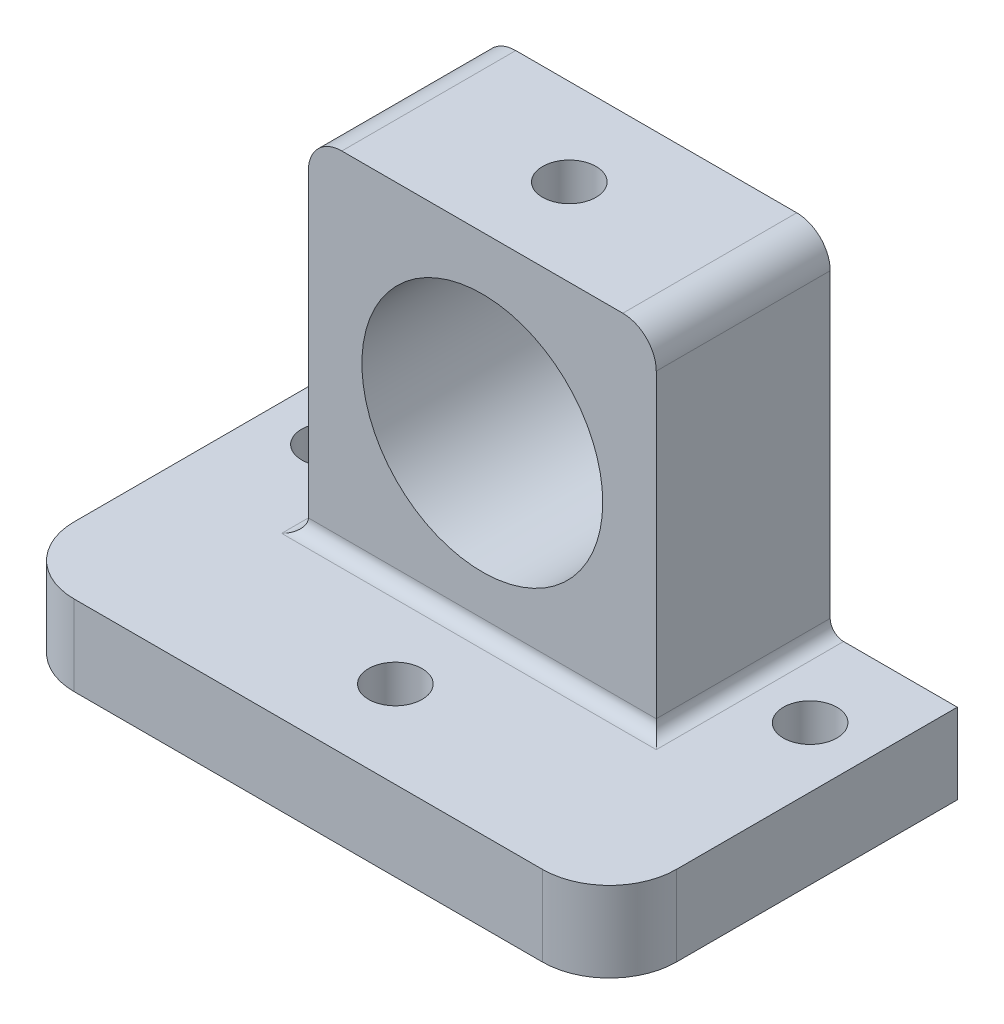
ISO-10303-21;
HEADER;
FILE_DESCRIPTION(('STEP AP214'),'2;1');
FILE_NAME('part.step','',(''),(''),'','','');
FILE_SCHEMA(('AUTOMOTIVE_DESIGN { 1 0 10303 214 1 1 1 1 }'));
ENDSEC;
DATA;
#1=APPLICATION_CONTEXT('core data for automotive mechanical design processes');
#2=APPLICATION_PROTOCOL_DEFINITION('international standard','automotive_design',2000,#1);
#3=PRODUCT_CONTEXT('',#1,'mechanical');
#4=PRODUCT('Part','Part','',(#3));
#5=PRODUCT_RELATED_PRODUCT_CATEGORY('part','',(#4));
#6=PRODUCT_DEFINITION_FORMATION('','',#4);
#7=PRODUCT_DEFINITION_CONTEXT('part definition',#1,'design');
#8=PRODUCT_DEFINITION('design','',#6,#7);
#9=PRODUCT_DEFINITION_SHAPE('','',#8);
#10=(LENGTH_UNIT() NAMED_UNIT(*) SI_UNIT(.MILLI.,.METRE.));
#11=(NAMED_UNIT(*) PLANE_ANGLE_UNIT() SI_UNIT($,.RADIAN.));
#12=(NAMED_UNIT(*) SI_UNIT($,.STERADIAN.) SOLID_ANGLE_UNIT());
#13=UNCERTAINTY_MEASURE_WITH_UNIT(LENGTH_MEASURE(1.E-05),#10,'distance_accuracy_value','');
#14=(GEOMETRIC_REPRESENTATION_CONTEXT(3) GLOBAL_UNCERTAINTY_ASSIGNED_CONTEXT((#13)) GLOBAL_UNIT_ASSIGNED_CONTEXT((#10,
#11,#12)) REPRESENTATION_CONTEXT('',''));
#15=CARTESIAN_POINT('',(0.,0.,0.));
#16=DIRECTION('',(0.,0.,1.));
#17=DIRECTION('',(1.,0.,0.));
#18=AXIS2_PLACEMENT_3D('',#15,#16,#17);
#19=CARTESIAN_POINT('',(-22.5,6.,0.));
#20=DIRECTION('',(1.,0.,0.));
#21=DIRECTION('',(0.,0.,-1.));
#22=AXIS2_PLACEMENT_3D('',#19,#20,#21);
#23=PLANE('',#22);
#24=DIRECTION('',(0.,0.,1.));
#25=VECTOR('',#24,1.);
#26=CARTESIAN_POINT('',(-22.5,0.,0.));
#27=LINE('',#26,#25);
#28=CARTESIAN_POINT('',(-22.5,0.,0.));
#29=VERTEX_POINT('',#28);
#30=CARTESIAN_POINT('',(-22.5,0.,21.));
#31=VERTEX_POINT('',#30);
#32=EDGE_CURVE('E166',#29,#31,#27,.T.);
#33=ORIENTED_EDGE('',*,*,#32,.T.);
#34=DIRECTION('',(0.,-1.,0.));
#35=VECTOR('',#34,1.);
#36=CARTESIAN_POINT('',(-22.5,6.,21.));
#37=LINE('',#36,#35);
#38=CARTESIAN_POINT('',(-22.5,6.,21.));
#39=VERTEX_POINT('',#38);
#40=EDGE_CURVE('E146',#39,#31,#37,.T.);
#41=ORIENTED_EDGE('',*,*,#40,.F.);
#42=DIRECTION('',(0.,0.,1.));
#43=VECTOR('',#42,1.);
#44=CARTESIAN_POINT('',(-22.5,6.,0.));
#45=LINE('',#44,#43);
#46=CARTESIAN_POINT('',(-22.5,6.,0.));
#47=VERTEX_POINT('',#46);
#48=EDGE_CURVE('E153',#47,#39,#45,.T.);
#49=ORIENTED_EDGE('',*,*,#48,.F.);
#50=DIRECTION('',(0.,-1.,0.));
#51=VECTOR('',#50,1.);
#52=CARTESIAN_POINT('',(-22.5,6.,0.));
#53=LINE('',#52,#51);
#54=EDGE_CURVE('E330',#47,#29,#53,.T.);
#55=ORIENTED_EDGE('',*,*,#54,.T.);
#56=EDGE_LOOP('',(#33,#41,#49,#55));
#57=FACE_BOUND('',#56,.T.);
#58=ADVANCED_FACE('F37',(#57),#23,.F.);
#59=CARTESIAN_POINT('',(-17.5,6.,21.));
#60=DIRECTION('',(0.,-1.,0.));
#61=DIRECTION('',(0.,0.,-1.));
#62=AXIS2_PLACEMENT_3D('',#59,#60,#61);
#63=CYLINDRICAL_SURFACE('',#62,5.);
#64=CARTESIAN_POINT('',(-17.5,0.,21.));
#65=DIRECTION('',(0.,1.,0.));
#66=DIRECTION('',(0.,0.,1.));
#67=AXIS2_PLACEMENT_3D('',#64,#65,#66);
#68=CIRCLE('',#67,5.);
#69=CARTESIAN_POINT('',(-17.5,0.,26.));
#70=VERTEX_POINT('',#69);
#71=EDGE_CURVE('E336',#31,#70,#68,.T.);
#72=ORIENTED_EDGE('',*,*,#71,.T.);
#73=DIRECTION('',(0.,-1.,0.));
#74=VECTOR('',#73,1.);
#75=CARTESIAN_POINT('',(-17.5,6.,26.));
#76=LINE('',#75,#74);
#77=CARTESIAN_POINT('',(-17.5,6.,26.));
#78=VERTEX_POINT('',#77);
#79=EDGE_CURVE('E149',#78,#70,#76,.T.);
#80=ORIENTED_EDGE('',*,*,#79,.F.);
#81=CARTESIAN_POINT('',(-17.5,6.,21.));
#82=DIRECTION('',(0.,1.,0.));
#83=DIRECTION('',(0.,0.,1.));
#84=AXIS2_PLACEMENT_3D('',#81,#82,#83);
#85=CIRCLE('',#84,5.);
#86=EDGE_CURVE('E142',#39,#78,#85,.T.);
#87=ORIENTED_EDGE('',*,*,#86,.F.);
#88=ORIENTED_EDGE('',*,*,#40,.T.);
#89=EDGE_LOOP('',(#72,#80,#87,#88));
#90=FACE_BOUND('',#89,.T.);
#91=ADVANCED_FACE('F144',(#90),#63,.T.);
#92=CARTESIAN_POINT('',(0.,6.,26.));
#93=DIRECTION('',(0.,0.,-1.));
#94=DIRECTION('',(-1.,0.,0.));
#95=AXIS2_PLACEMENT_3D('',#92,#93,#94);
#96=PLANE('',#95);
#97=DIRECTION('',(1.,0.,0.));
#98=VECTOR('',#97,1.);
#99=CARTESIAN_POINT('',(0.,0.,26.));
#100=LINE('',#99,#98);
#101=CARTESIAN_POINT('',(17.5,0.,26.));
#102=VERTEX_POINT('',#101);
#103=EDGE_CURVE('E338',#70,#102,#100,.T.);
#104=ORIENTED_EDGE('',*,*,#103,.T.);
#105=DIRECTION('',(0.,-1.,0.));
#106=VECTOR('',#105,1.);
#107=CARTESIAN_POINT('',(17.5,6.,26.));
#108=LINE('',#107,#106);
#109=CARTESIAN_POINT('',(17.5,6.,26.));
#110=VERTEX_POINT('',#109);
#111=EDGE_CURVE('E172',#110,#102,#108,.T.);
#112=ORIENTED_EDGE('',*,*,#111,.F.);
#113=DIRECTION('',(1.,0.,0.));
#114=VECTOR('',#113,1.);
#115=CARTESIAN_POINT('',(0.,6.,26.));
#116=LINE('',#115,#114);
#117=EDGE_CURVE('E152',#78,#110,#116,.T.);
#118=ORIENTED_EDGE('',*,*,#117,.F.);
#119=ORIENTED_EDGE('',*,*,#79,.T.);
#120=EDGE_LOOP('',(#104,#112,#118,#119));
#121=FACE_BOUND('',#120,.T.);
#122=ADVANCED_FACE('F279',(#121),#96,.F.);
#123=CARTESIAN_POINT('',(17.5,6.,21.));
#124=DIRECTION('',(0.,-1.,0.));
#125=DIRECTION('',(0.,0.,-1.));
#126=AXIS2_PLACEMENT_3D('',#123,#124,#125);
#127=CYLINDRICAL_SURFACE('',#126,5.);
#128=CARTESIAN_POINT('',(17.5,0.,21.));
#129=DIRECTION('',(0.,1.,0.));
#130=DIRECTION('',(0.,0.,1.));
#131=AXIS2_PLACEMENT_3D('',#128,#129,#130);
#132=CIRCLE('',#131,5.);
#133=CARTESIAN_POINT('',(22.5,0.,21.));
#134=VERTEX_POINT('',#133);
#135=EDGE_CURVE('E340',#102,#134,#132,.T.);
#136=ORIENTED_EDGE('',*,*,#135,.T.);
#137=DIRECTION('',(0.,-1.,0.));
#138=VECTOR('',#137,1.);
#139=CARTESIAN_POINT('',(22.5,6.,21.));
#140=LINE('',#139,#138);
#141=CARTESIAN_POINT('',(22.5,6.,21.));
#142=VERTEX_POINT('',#141);
#143=EDGE_CURVE('E357',#142,#134,#140,.T.);
#144=ORIENTED_EDGE('',*,*,#143,.F.);
#145=CARTESIAN_POINT('',(17.5,6.,21.));
#146=DIRECTION('',(0.,1.,0.));
#147=DIRECTION('',(0.,0.,1.));
#148=AXIS2_PLACEMENT_3D('',#145,#146,#147);
#149=CIRCLE('',#148,5.);
#150=EDGE_CURVE('E321',#110,#142,#149,.T.);
#151=ORIENTED_EDGE('',*,*,#150,.F.);
#152=ORIENTED_EDGE('',*,*,#111,.T.);
#153=EDGE_LOOP('',(#136,#144,#151,#152));
#154=FACE_BOUND('',#153,.T.);
#155=ADVANCED_FACE('F275',(#154),#127,.T.);
#156=CARTESIAN_POINT('',(22.5,6.,0.));
#157=DIRECTION('',(1.,0.,0.));
#158=DIRECTION('',(0.,0.,-1.));
#159=AXIS2_PLACEMENT_3D('',#156,#157,#158);
#160=PLANE('',#159);
#161=DIRECTION('',(0.,0.,1.));
#162=VECTOR('',#161,1.);
#163=CARTESIAN_POINT('',(22.5,0.,0.));
#164=LINE('',#163,#162);
#165=CARTESIAN_POINT('',(22.5,0.,0.));
#166=VERTEX_POINT('',#165);
#167=EDGE_CURVE('E343',#166,#134,#164,.T.);
#168=ORIENTED_EDGE('',*,*,#167,.F.);
#169=DIRECTION('',(0.,-1.,0.));
#170=VECTOR('',#169,1.);
#171=CARTESIAN_POINT('',(22.5,6.,0.));
#172=LINE('',#171,#170);
#173=CARTESIAN_POINT('',(22.5,6.,0.));
#174=VERTEX_POINT('',#173);
#175=EDGE_CURVE('E355',#174,#166,#172,.T.);
#176=ORIENTED_EDGE('',*,*,#175,.F.);
#177=DIRECTION('',(0.,0.,1.));
#178=VECTOR('',#177,1.);
#179=CARTESIAN_POINT('',(22.5,6.,0.));
#180=LINE('',#179,#178);
#181=EDGE_CURVE('E318',#174,#142,#180,.T.);
#182=ORIENTED_EDGE('',*,*,#181,.T.);
#183=ORIENTED_EDGE('',*,*,#143,.T.);
#184=EDGE_LOOP('',(#168,#176,#182,#183));
#185=FACE_BOUND('',#184,.T.);
#186=ADVANCED_FACE('F268',(#185),#160,.T.);
#187=CARTESIAN_POINT('',(-18.,6.,6.5));
#188=DIRECTION('',(0.,-1.,0.));
#189=DIRECTION('',(0.,0.,-1.));
#190=AXIS2_PLACEMENT_3D('',#187,#188,#189);
#191=CYLINDRICAL_SURFACE('',#190,2.);
#192=CARTESIAN_POINT('',(-18.,6.,6.5));
#193=DIRECTION('',(0.,1.,0.));
#194=DIRECTION('',(0.,0.,1.));
#195=AXIS2_PLACEMENT_3D('',#192,#193,#194);
#196=CIRCLE('',#195,2.);
#197=CARTESIAN_POINT('',(-18.,6.,8.5));
#198=VERTEX_POINT('',#197);
#199=EDGE_CURVE('E320',#198,#198,#196,.T.);
#200=ORIENTED_EDGE('',*,*,#199,.T.);
#201=EDGE_LOOP('',(#200));
#202=FACE_BOUND('',#201,.T.);
#203=CARTESIAN_POINT('',(-18.,0.,6.5));
#204=DIRECTION('',(0.,1.,0.));
#205=DIRECTION('',(0.,0.,1.));
#206=AXIS2_PLACEMENT_3D('',#203,#204,#205);
#207=CIRCLE('',#206,2.);
#208=CARTESIAN_POINT('',(-18.,0.,8.5));
#209=VERTEX_POINT('',#208);
#210=EDGE_CURVE('E348',#209,#209,#207,.T.);
#211=ORIENTED_EDGE('',*,*,#210,.F.);
#212=EDGE_LOOP('',(#211));
#213=FACE_BOUND('',#212,.T.);
#214=ADVANCED_FACE('F264',(#202,#213),#191,.F.);
#215=CARTESIAN_POINT('',(0.,6.,0.));
#216=DIRECTION('',(0.,0.,-1.));
#217=DIRECTION('',(-1.,0.,0.));
#218=AXIS2_PLACEMENT_3D('',#215,#216,#217);
#219=PLANE('',#218);
#220=CARTESIAN_POINT('',(0.,19.,0.));
#221=DIRECTION('',(0.,0.,1.));
#222=DIRECTION('',(1.,0.,0.));
#223=AXIS2_PLACEMENT_3D('',#220,#221,#222);
#224=CIRCLE('',#223,9.);
#225=CARTESIAN_POINT('',(9.,19.,0.));
#226=VERTEX_POINT('',#225);
#227=EDGE_CURVE('E384',#226,#226,#224,.T.);
#228=ORIENTED_EDGE('',*,*,#227,.T.);
#229=EDGE_LOOP('',(#228));
#230=FACE_BOUND('',#229,.T.);
#231=DIRECTION('',(0.,-1.,0.));
#232=VECTOR('',#231,1.);
#233=CARTESIAN_POINT('',(-13.,32.,0.));
#234=LINE('',#233,#232);
#235=CARTESIAN_POINT('',(-13.,29.5,0.));
#236=VERTEX_POINT('',#235);
#237=CARTESIAN_POINT('',(-13.,7.,0.));
#238=VERTEX_POINT('',#237);
#239=EDGE_CURVE('E373',#236,#238,#234,.T.);
#240=ORIENTED_EDGE('',*,*,#239,.F.);
#241=CARTESIAN_POINT('',(-10.5,29.5,0.));
#242=DIRECTION('',(0.,0.,-1.));
#243=DIRECTION('',(-1.,0.,0.));
#244=AXIS2_PLACEMENT_3D('',#241,#242,#243);
#245=CIRCLE('',#244,2.5);
#246=CARTESIAN_POINT('',(-10.5,32.,0.));
#247=VERTEX_POINT('',#246);
#248=EDGE_CURVE('E177',#236,#247,#245,.T.);
#249=ORIENTED_EDGE('',*,*,#248,.T.);
#250=DIRECTION('',(1.,0.,0.));
#251=VECTOR('',#250,1.);
#252=CARTESIAN_POINT('',(0.,32.,0.));
#253=LINE('',#252,#251);
#254=CARTESIAN_POINT('',(10.5,32.,0.));
#255=VERTEX_POINT('',#254);
#256=EDGE_CURVE('E378',#247,#255,#253,.T.);
#257=ORIENTED_EDGE('',*,*,#256,.T.);
#258=CARTESIAN_POINT('',(10.5,29.5,0.));
#259=DIRECTION('',(0.,0.,-1.));
#260=DIRECTION('',(-1.,0.,0.));
#261=AXIS2_PLACEMENT_3D('',#258,#259,#260);
#262=CIRCLE('',#261,2.5);
#263=CARTESIAN_POINT('',(13.,29.5,0.));
#264=VERTEX_POINT('',#263);
#265=EDGE_CURVE('E170',#255,#264,#262,.T.);
#266=ORIENTED_EDGE('',*,*,#265,.T.);
#267=DIRECTION('',(0.,-1.,0.));
#268=VECTOR('',#267,1.);
#269=CARTESIAN_POINT('',(13.,32.,0.));
#270=LINE('',#269,#268);
#271=CARTESIAN_POINT('',(13.,7.,0.));
#272=VERTEX_POINT('',#271);
#273=EDGE_CURVE('E315',#264,#272,#270,.T.);
#274=ORIENTED_EDGE('',*,*,#273,.T.);
#275=CARTESIAN_POINT('',(14.,7.,0.));
#276=DIRECTION('',(0.,0.,-1.));
#277=DIRECTION('',(-1.,0.,0.));
#278=AXIS2_PLACEMENT_3D('',#275,#276,#277);
#279=CIRCLE('',#278,1.);
#280=CARTESIAN_POINT('',(14.,6.,0.));
#281=VERTEX_POINT('',#280);
#282=EDGE_CURVE('E11',#272,#281,#279,.F.);
#283=ORIENTED_EDGE('',*,*,#282,.T.);
#284=DIRECTION('',(1.,0.,0.));
#285=VECTOR('',#284,1.);
#286=CARTESIAN_POINT('',(0.,6.,0.));
#287=LINE('',#286,#285);
#288=EDGE_CURVE('E313',#281,#174,#287,.T.);
#289=ORIENTED_EDGE('',*,*,#288,.T.);
#290=ORIENTED_EDGE('',*,*,#175,.T.);
#291=DIRECTION('',(1.,0.,0.));
#292=VECTOR('',#291,1.);
#293=CARTESIAN_POINT('',(0.,0.,0.));
#294=LINE('',#293,#292);
#295=EDGE_CURVE('E346',#29,#166,#294,.T.);
#296=ORIENTED_EDGE('',*,*,#295,.F.);
#297=ORIENTED_EDGE('',*,*,#54,.F.);
#298=CARTESIAN_POINT('',(-14.,6.,0.));
#299=VERTEX_POINT('',#298);
#300=EDGE_CURVE('E161',#47,#299,#287,.T.);
#301=ORIENTED_EDGE('',*,*,#300,.T.);
#302=CARTESIAN_POINT('',(-14.,7.,0.));
#303=DIRECTION('',(0.,0.,-1.));
#304=DIRECTION('',(-1.,0.,0.));
#305=AXIS2_PLACEMENT_3D('',#302,#303,#304);
#306=CIRCLE('',#305,1.);
#307=EDGE_CURVE('E46',#299,#238,#306,.F.);
#308=ORIENTED_EDGE('',*,*,#307,.T.);
#309=EDGE_LOOP('',(#240,#249,#257,#266,#274,#283,#289,#290,#296,#297,#301,#308));
#310=FACE_BOUND('',#309,.T.);
#311=ADVANCED_FACE('F267',(#230,#310),#219,.T.);
#312=CARTESIAN_POINT('',(0.,6.,19.5));
#313=DIRECTION('',(0.,-1.,0.));
#314=DIRECTION('',(0.,0.,-1.));
#315=AXIS2_PLACEMENT_3D('',#312,#313,#314);
#316=CYLINDRICAL_SURFACE('',#315,2.);
#317=CARTESIAN_POINT('',(0.,6.,19.5));
#318=DIRECTION('',(0.,1.,0.));
#319=DIRECTION('',(0.,0.,1.));
#320=AXIS2_PLACEMENT_3D('',#317,#318,#319);
#321=CIRCLE('',#320,2.);
#322=CARTESIAN_POINT('',(0.,6.,21.5));
#323=VERTEX_POINT('',#322);
#324=EDGE_CURVE('E163',#323,#323,#321,.T.);
#325=ORIENTED_EDGE('',*,*,#324,.T.);
#326=EDGE_LOOP('',(#325));
#327=FACE_BOUND('',#326,.T.);
#328=CARTESIAN_POINT('',(0.,0.,19.5));
#329=DIRECTION('',(0.,1.,0.));
#330=DIRECTION('',(0.,0.,1.));
#331=AXIS2_PLACEMENT_3D('',#328,#329,#330);
#332=CIRCLE('',#331,2.);
#333=CARTESIAN_POINT('',(0.,0.,21.5));
#334=VERTEX_POINT('',#333);
#335=EDGE_CURVE('E331',#334,#334,#332,.T.);
#336=ORIENTED_EDGE('',*,*,#335,.F.);
#337=EDGE_LOOP('',(#336));
#338=FACE_BOUND('',#337,.T.);
#339=ADVANCED_FACE('F262',(#327,#338),#316,.F.);
#340=CARTESIAN_POINT('',(18.,6.,6.5));
#341=DIRECTION('',(0.,-1.,0.));
#342=DIRECTION('',(0.,0.,-1.));
#343=AXIS2_PLACEMENT_3D('',#340,#341,#342);
#344=CYLINDRICAL_SURFACE('',#343,2.);
#345=CARTESIAN_POINT('',(18.,6.,6.5));
#346=DIRECTION('',(0.,1.,0.));
#347=DIRECTION('',(0.,0.,1.));
#348=AXIS2_PLACEMENT_3D('',#345,#346,#347);
#349=CIRCLE('',#348,2.);
#350=CARTESIAN_POINT('',(18.,6.,8.5));
#351=VERTEX_POINT('',#350);
#352=EDGE_CURVE('E327',#351,#351,#349,.F.);
#353=ORIENTED_EDGE('',*,*,#352,.F.);
#354=EDGE_LOOP('',(#353));
#355=FACE_BOUND('',#354,.T.);
#356=CARTESIAN_POINT('',(18.,0.,6.5));
#357=DIRECTION('',(0.,1.,0.));
#358=DIRECTION('',(0.,0.,1.));
#359=AXIS2_PLACEMENT_3D('',#356,#357,#358);
#360=CIRCLE('',#359,2.);
#361=CARTESIAN_POINT('',(18.,0.,8.5));
#362=VERTEX_POINT('',#361);
#363=EDGE_CURVE('E351',#362,#362,#360,.F.);
#364=ORIENTED_EDGE('',*,*,#363,.T.);
#365=EDGE_LOOP('',(#364));
#366=FACE_BOUND('',#365,.T.);
#367=ADVANCED_FACE('F255',(#355,#366),#344,.F.);
#368=CARTESIAN_POINT('',(0.,6.,0.));
#369=DIRECTION('',(0.,1.,0.));
#370=DIRECTION('',(0.,0.,1.));
#371=AXIS2_PLACEMENT_3D('',#368,#369,#370);
#372=PLANE('',#371);
#373=ORIENTED_EDGE('',*,*,#324,.F.);
#374=EDGE_LOOP('',(#373));
#375=FACE_BOUND('',#374,.T.);
#376=DIRECTION('',(1.,0.,0.));
#377=VECTOR('',#376,1.);
#378=CARTESIAN_POINT('',(0.,6.,13.9999999999942));
#379=LINE('',#378,#377);
#380=CARTESIAN_POINT('',(14.,6.,13.9999999999942));
#381=VERTEX_POINT('',#380);
#382=CARTESIAN_POINT('',(-14.,6.,13.9999999999942));
#383=VERTEX_POINT('',#382);
#384=EDGE_CURVE('E192',#381,#383,#379,.F.);
#385=ORIENTED_EDGE('',*,*,#384,.T.);
#386=DIRECTION('',(0.,0.,-1.));
#387=VECTOR('',#386,1.);
#388=CARTESIAN_POINT('',(-14.,6.,0.));
#389=LINE('',#388,#387);
#390=EDGE_CURVE('E194',#383,#299,#389,.T.);
#391=ORIENTED_EDGE('',*,*,#390,.T.);
#392=ORIENTED_EDGE('',*,*,#300,.F.);
#393=ORIENTED_EDGE('',*,*,#48,.T.);
#394=ORIENTED_EDGE('',*,*,#86,.T.);
#395=ORIENTED_EDGE('',*,*,#117,.T.);
#396=ORIENTED_EDGE('',*,*,#150,.T.);
#397=ORIENTED_EDGE('',*,*,#181,.F.);
#398=ORIENTED_EDGE('',*,*,#288,.F.);
#399=DIRECTION('',(0.,0.,-1.));
#400=VECTOR('',#399,1.);
#401=CARTESIAN_POINT('',(14.,6.,0.));
#402=LINE('',#401,#400);
#403=EDGE_CURVE('E190',#281,#381,#402,.F.);
#404=ORIENTED_EDGE('',*,*,#403,.T.);
#405=EDGE_LOOP('',(#385,#391,#392,#393,#394,#395,#396,#397,#398,#404));
#406=FACE_BOUND('',#405,.T.);
#407=ORIENTED_EDGE('',*,*,#199,.F.);
#408=EDGE_LOOP('',(#407));
#409=FACE_BOUND('',#408,.T.);
#410=ORIENTED_EDGE('',*,*,#352,.T.);
#411=EDGE_LOOP('',(#410));
#412=FACE_BOUND('',#411,.T.);
#413=ADVANCED_FACE('F157',(#375,#406,#409,#412),#372,.T.);
#414=CARTESIAN_POINT('',(0.,0.,0.));
#415=DIRECTION('',(0.,1.,0.));
#416=DIRECTION('',(0.,0.,1.));
#417=AXIS2_PLACEMENT_3D('',#414,#415,#416);
#418=PLANE('',#417);
#419=ORIENTED_EDGE('',*,*,#295,.T.);
#420=ORIENTED_EDGE('',*,*,#167,.T.);
#421=ORIENTED_EDGE('',*,*,#135,.F.);
#422=ORIENTED_EDGE('',*,*,#103,.F.);
#423=ORIENTED_EDGE('',*,*,#71,.F.);
#424=ORIENTED_EDGE('',*,*,#32,.F.);
#425=EDGE_LOOP('',(#419,#420,#421,#422,#423,#424));
#426=FACE_BOUND('',#425,.T.);
#427=ORIENTED_EDGE('',*,*,#335,.T.);
#428=EDGE_LOOP('',(#427));
#429=FACE_BOUND('',#428,.T.);
#430=ORIENTED_EDGE('',*,*,#210,.T.);
#431=EDGE_LOOP('',(#430));
#432=FACE_BOUND('',#431,.T.);
#433=ORIENTED_EDGE('',*,*,#363,.F.);
#434=EDGE_LOOP('',(#433));
#435=FACE_BOUND('',#434,.T.);
#436=ADVANCED_FACE('F251',(#426,#429,#432,#435),#418,.F.);
#437=CARTESIAN_POINT('',(0.,32.,12.9999999999942));
#438=DIRECTION('',(0.,0.,-1.));
#439=DIRECTION('',(-1.,0.,0.));
#440=AXIS2_PLACEMENT_3D('',#437,#438,#439);
#441=PLANE('',#440);
#442=CARTESIAN_POINT('',(0.,19.,12.9999999999942));
#443=DIRECTION('',(0.,0.,1.));
#444=DIRECTION('',(1.,0.,0.));
#445=AXIS2_PLACEMENT_3D('',#442,#443,#444);
#446=CIRCLE('',#445,9.);
#447=CARTESIAN_POINT('',(9.,19.,12.9999999999942));
#448=VERTEX_POINT('',#447);
#449=EDGE_CURVE('E217',#448,#448,#446,.T.);
#450=ORIENTED_EDGE('',*,*,#449,.F.);
#451=EDGE_LOOP('',(#450));
#452=FACE_BOUND('',#451,.T.);
#453=DIRECTION('',(0.,-1.,0.));
#454=VECTOR('',#453,1.);
#455=CARTESIAN_POINT('',(-13.,32.,12.9999999999942));
#456=LINE('',#455,#454);
#457=CARTESIAN_POINT('',(-13.,29.5,12.9999999999942));
#458=VERTEX_POINT('',#457);
#459=CARTESIAN_POINT('',(-13.,7.,12.9999999999942));
#460=VERTEX_POINT('',#459);
#461=EDGE_CURVE('E376',#458,#460,#456,.T.);
#462=ORIENTED_EDGE('',*,*,#461,.T.);
#463=DIRECTION('',(1.,0.,0.));
#464=VECTOR('',#463,1.);
#465=CARTESIAN_POINT('',(0.,7.,12.9999999999942));
#466=LINE('',#465,#464);
#467=CARTESIAN_POINT('',(13.,7.,12.9999999999942));
#468=VERTEX_POINT('',#467);
#469=EDGE_CURVE('E62',#460,#468,#466,.T.);
#470=ORIENTED_EDGE('',*,*,#469,.T.);
#471=DIRECTION('',(0.,-1.,0.));
#472=VECTOR('',#471,1.);
#473=CARTESIAN_POINT('',(13.,32.,12.9999999999942));
#474=LINE('',#473,#472);
#475=CARTESIAN_POINT('',(13.,29.5,12.9999999999942));
#476=VERTEX_POINT('',#475);
#477=EDGE_CURVE('E334',#476,#468,#474,.T.);
#478=ORIENTED_EDGE('',*,*,#477,.F.);
#479=CARTESIAN_POINT('',(10.5,29.5,12.9999999999942));
#480=DIRECTION('',(0.,0.,-1.));
#481=DIRECTION('',(-1.,0.,0.));
#482=AXIS2_PLACEMENT_3D('',#479,#480,#481);
#483=CIRCLE('',#482,2.5);
#484=CARTESIAN_POINT('',(10.5,32.,12.9999999999942));
#485=VERTEX_POINT('',#484);
#486=EDGE_CURVE('E184',#476,#485,#483,.F.);
#487=ORIENTED_EDGE('',*,*,#486,.T.);
#488=DIRECTION('',(1.,0.,0.));
#489=VECTOR('',#488,1.);
#490=CARTESIAN_POINT('',(0.,32.,12.9999999999942));
#491=LINE('',#490,#489);
#492=CARTESIAN_POINT('',(-10.5,32.,12.9999999999942));
#493=VERTEX_POINT('',#492);
#494=EDGE_CURVE('E381',#493,#485,#491,.T.);
#495=ORIENTED_EDGE('',*,*,#494,.F.);
#496=CARTESIAN_POINT('',(-10.5,29.5,12.9999999999942));
#497=DIRECTION('',(0.,0.,-1.));
#498=DIRECTION('',(-1.,0.,0.));
#499=AXIS2_PLACEMENT_3D('',#496,#497,#498);
#500=CIRCLE('',#499,2.5);
#501=EDGE_CURVE('E186',#493,#458,#500,.F.);
#502=ORIENTED_EDGE('',*,*,#501,.T.);
#503=EDGE_LOOP('',(#462,#470,#478,#487,#495,#502));
#504=FACE_BOUND('',#503,.T.);
#505=ADVANCED_FACE('F248',(#452,#504),#441,.F.);
#506=CARTESIAN_POINT('',(13.,32.,0.));
#507=DIRECTION('',(-1.,0.,0.));
#508=DIRECTION('',(0.,0.,1.));
#509=AXIS2_PLACEMENT_3D('',#506,#507,#508);
#510=PLANE('',#509);
#511=ORIENTED_EDGE('',*,*,#477,.T.);
#512=DIRECTION('',(0.,0.,-1.));
#513=VECTOR('',#512,1.);
#514=CARTESIAN_POINT('',(13.,7.,0.));
#515=LINE('',#514,#513);
#516=EDGE_CURVE('E54',#468,#272,#515,.T.);
#517=ORIENTED_EDGE('',*,*,#516,.T.);
#518=ORIENTED_EDGE('',*,*,#273,.F.);
#519=DIRECTION('',(0.,0.,-1.));
#520=VECTOR('',#519,1.);
#521=CARTESIAN_POINT('',(13.,29.5,12.9999999999942));
#522=LINE('',#521,#520);
#523=EDGE_CURVE('E188',#264,#476,#522,.F.);
#524=ORIENTED_EDGE('',*,*,#523,.T.);
#525=EDGE_LOOP('',(#511,#517,#518,#524));
#526=FACE_BOUND('',#525,.T.);
#527=ADVANCED_FACE('F244',(#526),#510,.F.);
#528=CARTESIAN_POINT('',(-13.,32.,0.));
#529=DIRECTION('',(-1.,0.,0.));
#530=DIRECTION('',(0.,0.,1.));
#531=AXIS2_PLACEMENT_3D('',#528,#529,#530);
#532=PLANE('',#531);
#533=ORIENTED_EDGE('',*,*,#239,.T.);
#534=DIRECTION('',(0.,0.,-1.));
#535=VECTOR('',#534,1.);
#536=CARTESIAN_POINT('',(-13.,7.,12.9999999999942));
#537=LINE('',#536,#535);
#538=EDGE_CURVE('E196',#238,#460,#537,.F.);
#539=ORIENTED_EDGE('',*,*,#538,.T.);
#540=ORIENTED_EDGE('',*,*,#461,.F.);
#541=DIRECTION('',(0.,0.,-1.));
#542=VECTOR('',#541,1.);
#543=CARTESIAN_POINT('',(-13.,29.5,0.));
#544=LINE('',#543,#542);
#545=EDGE_CURVE('E167',#458,#236,#544,.T.);
#546=ORIENTED_EDGE('',*,*,#545,.T.);
#547=EDGE_LOOP('',(#533,#539,#540,#546));
#548=FACE_BOUND('',#547,.T.);
#549=ADVANCED_FACE('F240',(#548),#532,.T.);
#550=CARTESIAN_POINT('',(0.,32.,0.));
#551=DIRECTION('',(0.,1.,0.));
#552=DIRECTION('',(0.,0.,1.));
#553=AXIS2_PLACEMENT_3D('',#550,#551,#552);
#554=PLANE('',#553);
#555=CARTESIAN_POINT('',(0.,32.,6.5));
#556=DIRECTION('',(0.,1.,0.));
#557=DIRECTION('',(0.,0.,1.));
#558=AXIS2_PLACEMENT_3D('',#555,#556,#557);
#559=CIRCLE('',#558,2.);
#560=CARTESIAN_POINT('',(0.,32.,8.5));
#561=VERTEX_POINT('',#560);
#562=EDGE_CURVE('E212',#561,#561,#559,.T.);
#563=ORIENTED_EDGE('',*,*,#562,.F.);
#564=EDGE_LOOP('',(#563));
#565=FACE_BOUND('',#564,.T.);
#566=ORIENTED_EDGE('',*,*,#256,.F.);
#567=DIRECTION('',(0.,0.,-1.));
#568=VECTOR('',#567,1.);
#569=CARTESIAN_POINT('',(-10.5,32.,0.));
#570=LINE('',#569,#568);
#571=EDGE_CURVE('E182',#247,#493,#570,.F.);
#572=ORIENTED_EDGE('',*,*,#571,.T.);
#573=ORIENTED_EDGE('',*,*,#494,.T.);
#574=DIRECTION('',(0.,0.,-1.));
#575=VECTOR('',#574,1.);
#576=CARTESIAN_POINT('',(10.5,32.,0.));
#577=LINE('',#576,#575);
#578=EDGE_CURVE('E179',#485,#255,#577,.T.);
#579=ORIENTED_EDGE('',*,*,#578,.T.);
#580=EDGE_LOOP('',(#566,#572,#573,#579));
#581=FACE_BOUND('',#580,.T.);
#582=ADVANCED_FACE('F236',(#565,#581),#554,.T.);
#583=CARTESIAN_POINT('',(-10.5,29.5,0.));
#584=DIRECTION('',(0.,0.,-1.));
#585=DIRECTION('',(-1.,0.,0.));
#586=AXIS2_PLACEMENT_3D('',#583,#584,#585);
#587=CYLINDRICAL_SURFACE('',#586,2.5);
#588=ORIENTED_EDGE('',*,*,#501,.F.);
#589=ORIENTED_EDGE('',*,*,#571,.F.);
#590=ORIENTED_EDGE('',*,*,#248,.F.);
#591=ORIENTED_EDGE('',*,*,#545,.F.);
#592=EDGE_LOOP('',(#588,#589,#590,#591));
#593=FACE_BOUND('',#592,.T.);
#594=ADVANCED_FACE('F239',(#593),#587,.T.);
#595=CARTESIAN_POINT('',(10.5,29.5,0.));
#596=DIRECTION('',(0.,0.,1.));
#597=DIRECTION('',(1.,0.,0.));
#598=AXIS2_PLACEMENT_3D('',#595,#596,#597);
#599=CYLINDRICAL_SURFACE('',#598,2.5);
#600=ORIENTED_EDGE('',*,*,#486,.F.);
#601=ORIENTED_EDGE('',*,*,#523,.F.);
#602=ORIENTED_EDGE('',*,*,#265,.F.);
#603=ORIENTED_EDGE('',*,*,#578,.F.);
#604=EDGE_LOOP('',(#600,#601,#602,#603));
#605=FACE_BOUND('',#604,.T.);
#606=ADVANCED_FACE('F234',(#605),#599,.T.);
#607=CARTESIAN_POINT('',(0.,19.,0.));
#608=DIRECTION('',(0.,0.,1.));
#609=DIRECTION('',(1.,0.,0.));
#610=AXIS2_PLACEMENT_3D('',#607,#608,#609);
#611=CYLINDRICAL_SURFACE('',#610,9.);
#612=CARTESIAN_POINT('',(0.,28.,8.5));
#613=CARTESIAN_POINT('',(-0.110880476775648,27.9999979621825,8.49999627632018));
#614=CARTESIAN_POINT('',(-0.221805565269619,27.9979301399569,8.49074801833651));
#615=CARTESIAN_POINT('',(-0.440501944103133,27.9898809775767,8.45403952764945));
#616=CARTESIAN_POINT('',(-0.548270975138987,27.9838969021735,8.42656656599072));
#617=CARTESIAN_POINT('',(-0.757463277761528,27.9686811316901,8.35431402950835));
#618=CARTESIAN_POINT('',(-0.858893152100284,27.9594528843908,8.30955282300213));
#619=CARTESIAN_POINT('',(-1.05280018031376,27.9387433544138,8.2040533875276));
#620=CARTESIAN_POINT('',(-1.14527750793334,27.9272621154736,8.14331546870939));
#621=CARTESIAN_POINT('',(-1.32018631401403,27.9030909417421,8.00652433489332));
#622=CARTESIAN_POINT('',(-1.40244861204353,27.8903856164143,7.93025749786486));
#623=CARTESIAN_POINT('',(-1.55312491045837,27.8653060107979,7.76503193990686));
#624=CARTESIAN_POINT('',(-1.62153764410855,27.8529317608805,7.67607205928954));
#625=CARTESIAN_POINT('',(-1.7433244341035,27.8297632826171,7.4867281559417));
#626=CARTESIAN_POINT('',(-1.79651742104403,27.8189887574298,7.38622504195847));
#627=CARTESIAN_POINT('',(-1.88519298954508,27.8004609635239,7.17742723830758));
#628=CARTESIAN_POINT('',(-1.92067776220096,27.7927073210477,7.06913351449575));
#629=CARTESIAN_POINT('',(-1.97236858006404,27.7812560945919,6.84966652267734));
#630=CARTESIAN_POINT('',(-1.98887467038069,27.7774954580778,6.73856728489457));
#631=CARTESIAN_POINT('',(-2.00307270997673,27.7742667373067,6.5151177822138));
#632=CARTESIAN_POINT('',(-2.00076704911663,27.7747981077894,6.40276767803785));
#633=CARTESIAN_POINT('',(-1.97764827517302,27.7800363214815,6.1822433728062));
#634=CARTESIAN_POINT('',(-1.95718464460217,27.7846643138484,6.07403037586065));
#635=CARTESIAN_POINT('',(-1.89888490681146,27.7974495419168,5.862612856675));
#636=CARTESIAN_POINT('',(-1.86104779681651,27.8056069813318,5.7594086239146));
#637=CARTESIAN_POINT('',(-1.76875672872875,27.824609099703,5.55996056161812));
#638=CARTESIAN_POINT('',(-1.71416919379353,27.8354752436249,5.46378067266393));
#639=CARTESIAN_POINT('',(-1.59002068139849,27.8586573791074,5.28181712948411));
#640=CARTESIAN_POINT('',(-1.52045760074274,27.870973574206,5.19603493817985));
#641=CARTESIAN_POINT('',(-1.36648683702983,27.8960057461267,5.03529069065153));
#642=CARTESIAN_POINT('',(-1.28178220526623,27.9087245068787,4.96061321489494));
#643=CARTESIAN_POINT('',(-1.10090661809162,27.9328783912232,4.82647627109289));
#644=CARTESIAN_POINT('',(-1.00473544183737,27.9443134900843,4.76701709621811));
#645=CARTESIAN_POINT('',(-0.803303190734733,27.9646506423361,4.66493072422319));
#646=CARTESIAN_POINT('',(-0.698022122319853,27.9735469300766,4.62234175569174));
#647=CARTESIAN_POINT('',(-0.481555930981455,27.9877613636625,4.55553898694213));
#648=CARTESIAN_POINT('',(-0.370371697593364,27.9930800469679,4.53132242658588));
#649=CARTESIAN_POINT('',(-0.147695483280843,27.9994631776167,4.50236798674483));
#650=CARTESIAN_POINT('',(-0.0362563973189034,28.0006124862229,4.49724149983832));
#651=CARTESIAN_POINT('',(0.185885923928081,27.998765586506,4.50555810426037));
#652=CARTESIAN_POINT('',(0.296589210270647,27.9957696689046,4.51899989331945));
#653=CARTESIAN_POINT('',(0.512823257329423,27.9860225875861,4.5637494151681));
#654=CARTESIAN_POINT('',(0.618398491715486,27.9793144700776,4.59485245622345));
#655=CARTESIAN_POINT('',(0.822832805855833,27.962894210868,4.67381368744508));
#656=CARTESIAN_POINT('',(0.921691300010179,27.9531818076466,4.72167333630601));
#657=CARTESIAN_POINT('',(1.11148643989438,27.9316215322764,4.83359287679899));
#658=CARTESIAN_POINT('',(1.20228573083225,27.9197444459025,4.89787994300616));
#659=CARTESIAN_POINT('',(1.37194696498812,27.8952303234908,5.04053124910144));
#660=CARTESIAN_POINT('',(1.45080730173413,27.8825931855018,5.1188973803321));
#661=CARTESIAN_POINT('',(1.59589548190986,27.8576887894581,5.2892680335807));
#662=CARTESIAN_POINT('',(1.66185381940073,27.8454331766428,5.3815040900066));
#663=CARTESIAN_POINT('',(1.77734611922752,27.8229539537831,5.57597203441081));
#664=CARTESIAN_POINT('',(1.82688079926974,27.8127302549527,5.6782034853421));
#665=CARTESIAN_POINT('',(1.90778001896259,27.7955720054893,5.88920828910514));
#666=CARTESIAN_POINT('',(1.93924786354759,27.7886187965979,5.99794044226884));
#667=CARTESIAN_POINT('',(1.98342027658406,27.7787564969739,6.21932418486247));
#668=CARTESIAN_POINT('',(1.99612795718356,27.7758467354733,6.33197512102596));
#669=CARTESIAN_POINT('',(2.00228356641044,27.7744440144898,6.55527887827833));
#670=CARTESIAN_POINT('',(1.99615913143933,27.7758529837012,6.66591950806006));
#671=CARTESIAN_POINT('',(1.96578277121688,27.7827066495755,6.88454970996682));
#672=CARTESIAN_POINT('',(1.9415310740024,27.7881512954703,6.99253931542349));
#673=CARTESIAN_POINT('',(1.87579819980744,27.8024142813153,7.20244912022738));
#674=CARTESIAN_POINT('',(1.83438116628454,27.8112200518277,7.3043903168816));
#675=CARTESIAN_POINT('',(1.73554770348342,27.8312176446906,7.49993999254673));
#676=CARTESIAN_POINT('',(1.67812954585194,27.8424097247663,7.59354756996401));
#677=CARTESIAN_POINT('',(1.54751358990558,27.8662104283533,7.77187660894797));
#678=CARTESIAN_POINT('',(1.47401185511038,27.8788437136774,7.85637220492266));
#679=CARTESIAN_POINT('',(1.31392870594504,27.9039397417339,8.01197007393133));
#680=CARTESIAN_POINT('',(1.22734426623344,27.9164024442905,8.08306924050841));
#681=CARTESIAN_POINT('',(1.04214597064557,27.9399525972658,8.21077598291992));
#682=CARTESIAN_POINT('',(0.943385636634948,27.9510192349923,8.26717519973493));
#683=CARTESIAN_POINT('',(0.737560279778818,27.9703205836925,8.36248330418121));
#684=CARTESIAN_POINT('',(0.630502203312995,27.9785576327082,8.40140664004617));
#685=CARTESIAN_POINT('',(0.43613824772941,27.9898281290955,8.45384135027679));
#686=CARTESIAN_POINT('',(0.349871991901683,27.9936186902321,8.47111737366629));
#687=CARTESIAN_POINT('',(0.175746449894529,27.9987053745979,8.49419790430616));
#688=CARTESIAN_POINT('',(0.0878872388928791,28.0000016152361,8.50000295150191));
#689=CARTESIAN_POINT('',(0.,28.,8.5));
#690=B_SPLINE_CURVE_WITH_KNOTS('',3,(#612,#613,#614,#615,#616,#617,#618,#619,#620,#621,#622,
#623,#624,#625,#626,#627,#628,#629,#630,#631,#632,#633,#634,#635,#636,#637,#638,#639,#640,#641,
#642,#643,#644,#645,#646,#647,#648,#649,#650,#651,#652,#653,#654,#655,#656,#657,#658,#659,#660,
#661,#662,#663,#664,#665,#666,#667,#668,#669,#670,#671,#672,#673,#674,#675,#676,#677,#678,#679,
#680,#681,#682,#683,#684,#685,#686,#687,#688,#689),.UNSPECIFIED.,.T.,.F.,(4,2,2,2,2,2,2,2,2,2,2,
2,2,2,2,2,2,2,2,2,2,2,2,2,2,2,2,2,2,2,2,2,2,2,2,2,2,2,4),(0.,0.332319689729797,
0.664871731249283,0.997071412407458,1.32926464516989,1.66638072002079,2.00352761490514,
2.34453296297976,2.6854961068774,3.02099125638107,3.35644378496591,3.68557668145784,
4.0147285774694,4.34657669709581,4.678471452583,5.01778179808977,5.35709867969828,
5.69718012811238,6.03721047501988,6.37027992124269,6.70332600912267,7.03258869425167,
7.36188004945459,7.69599803262041,8.03016093387756,8.37069473105728,8.71121364510411,
9.04976559055243,9.38826136686411,9.71912785142416,10.0499901738286,10.3796271201578,
10.7092996858639,11.0458432631282,11.3824647846641,11.7236258704957,12.0645043787094,
12.3279234735856,12.5913301688795),.UNSPECIFIED.);
#691=CARTESIAN_POINT('',(0.,28.,8.5));
#692=VERTEX_POINT('',#691);
#693=EDGE_CURVE('E207',#692,#692,#690,.T.);
#694=ORIENTED_EDGE('',*,*,#693,.F.);
#695=EDGE_LOOP('',(#694));
#696=FACE_BOUND('',#695,.T.);
#697=ORIENTED_EDGE('',*,*,#227,.F.);
#698=EDGE_LOOP('',(#697));
#699=FACE_BOUND('',#698,.T.);
#700=ORIENTED_EDGE('',*,*,#449,.T.);
#701=EDGE_LOOP('',(#700));
#702=FACE_BOUND('',#701,.T.);
#703=ADVANCED_FACE('F230',(#696,#699,#702),#611,.F.);
#704=CARTESIAN_POINT('',(0.,-0.001000000000001,6.5));
#705=DIRECTION('',(0.,1.,0.));
#706=DIRECTION('',(0.,0.,1.));
#707=AXIS2_PLACEMENT_3D('',#704,#705,#706);
#708=CYLINDRICAL_SURFACE('',#707,2.);
#709=ORIENTED_EDGE('',*,*,#562,.T.);
#710=EDGE_LOOP('',(#709));
#711=FACE_BOUND('',#710,.T.);
#712=ORIENTED_EDGE('',*,*,#693,.T.);
#713=EDGE_LOOP('',(#712));
#714=FACE_BOUND('',#713,.T.);
#715=ADVANCED_FACE('F225',(#711,#714),#708,.F.);
#716=CARTESIAN_POINT('',(14.,7.,0.));
#717=DIRECTION('',(0.,0.,-1.));
#718=DIRECTION('',(-1.,0.,0.));
#719=AXIS2_PLACEMENT_3D('',#716,#717,#718);
#720=CYLINDRICAL_SURFACE('',#719,1.);
#721=ORIENTED_EDGE('',*,*,#282,.F.);
#722=ORIENTED_EDGE('',*,*,#516,.F.);
#723=CARTESIAN_POINT('',(14.,7.,13.9999999999942));
#724=DIRECTION('',(0.707106781186547,0.,-0.707106781186548));
#725=DIRECTION('',(-0.707106781186548,0.,-0.707106781186547));
#726=AXIS2_PLACEMENT_3D('',#723,#724,#725);
#727=ELLIPSE('',#726,1.4142135623731,1.);
#728=EDGE_CURVE('E41',#381,#468,#727,.T.);
#729=ORIENTED_EDGE('',*,*,#728,.F.);
#730=ORIENTED_EDGE('',*,*,#403,.F.);
#731=EDGE_LOOP('',(#721,#722,#729,#730));
#732=FACE_BOUND('',#731,.T.);
#733=ADVANCED_FACE('F39',(#732),#720,.F.);
#734=CARTESIAN_POINT('',(0.,7.,13.9999999999942));
#735=DIRECTION('',(1.,0.,0.));
#736=DIRECTION('',(0.,0.,-1.));
#737=AXIS2_PLACEMENT_3D('',#734,#735,#736);
#738=CYLINDRICAL_SURFACE('',#737,1.);
#739=ORIENTED_EDGE('',*,*,#728,.T.);
#740=ORIENTED_EDGE('',*,*,#469,.F.);
#741=CARTESIAN_POINT('',(-14.,7.,13.9999999999942));
#742=DIRECTION('',(0.707106781186548,0.,0.707106781186547));
#743=DIRECTION('',(0.707106781186547,0.,-0.707106781186548));
#744=AXIS2_PLACEMENT_3D('',#741,#742,#743);
#745=ELLIPSE('',#744,1.41421356237309,1.);
#746=EDGE_CURVE('E200',#383,#460,#745,.T.);
#747=ORIENTED_EDGE('',*,*,#746,.F.);
#748=ORIENTED_EDGE('',*,*,#384,.F.);
#749=EDGE_LOOP('',(#739,#740,#747,#748));
#750=FACE_BOUND('',#749,.T.);
#751=ADVANCED_FACE('F299',(#750),#738,.F.);
#752=CARTESIAN_POINT('',(-14.,7.,0.));
#753=DIRECTION('',(0.,0.,1.));
#754=DIRECTION('',(1.,0.,0.));
#755=AXIS2_PLACEMENT_3D('',#752,#753,#754);
#756=CYLINDRICAL_SURFACE('',#755,1.);
#757=ORIENTED_EDGE('',*,*,#746,.T.);
#758=ORIENTED_EDGE('',*,*,#538,.F.);
#759=ORIENTED_EDGE('',*,*,#307,.F.);
#760=ORIENTED_EDGE('',*,*,#390,.F.);
#761=EDGE_LOOP('',(#757,#758,#759,#760));
#762=FACE_BOUND('',#761,.T.);
#763=ADVANCED_FACE('F297',(#762),#756,.F.);
#764=CLOSED_SHELL('',(#58,#91,#122,#155,#186,#214,#311,#339,#367,#413,#436,#505,#527,#549,#582,
#594,#606,#703,#715,#733,#751,#763));
#765=MANIFOLD_SOLID_BREP('B2',#764);
#766=ADVANCED_BREP_SHAPE_REPRESENTATION('',(#18,#765),#14);
#767=SHAPE_DEFINITION_REPRESENTATION(#9,#766);
ENDSEC;
END-ISO-10303-21;
